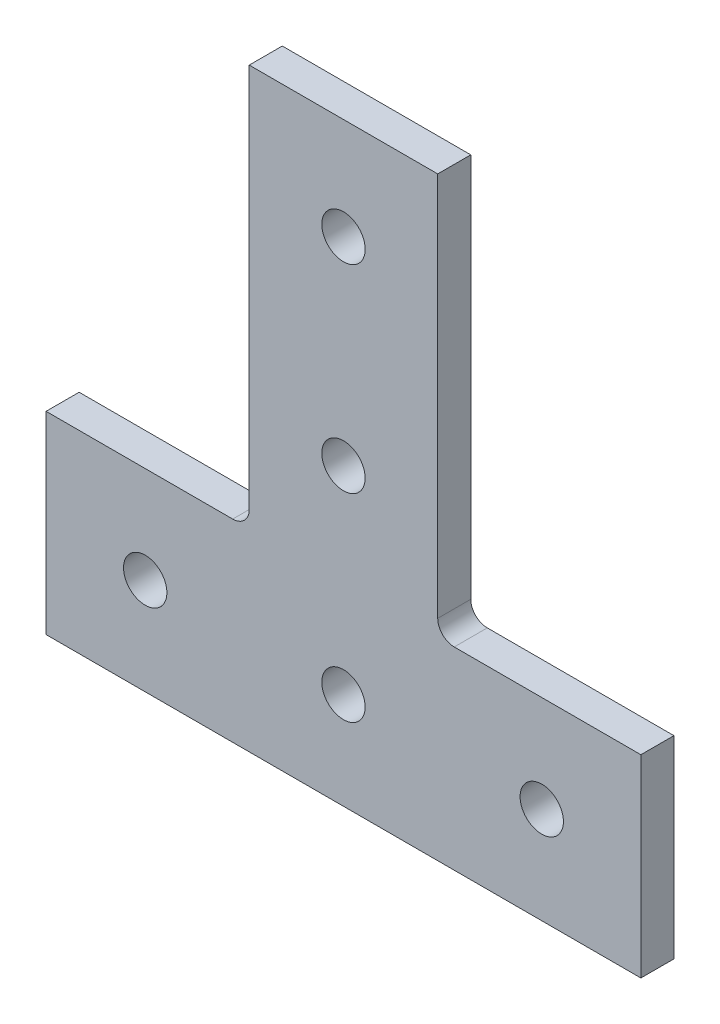
ISO-10303-21;
HEADER;
FILE_DESCRIPTION(('STEP AP214'),'2;1');
FILE_NAME('part.step','',(''),(''),'','','');
FILE_SCHEMA(('AUTOMOTIVE_DESIGN { 1 0 10303 214 1 1 1 1 }'));
ENDSEC;
DATA;
#1=APPLICATION_CONTEXT('core data for automotive mechanical design processes');
#2=APPLICATION_PROTOCOL_DEFINITION('international standard','automotive_design',2000,#1);
#3=PRODUCT_CONTEXT('',#1,'mechanical');
#4=PRODUCT('Part','Part','',(#3));
#5=PRODUCT_RELATED_PRODUCT_CATEGORY('part','',(#4));
#6=PRODUCT_DEFINITION_FORMATION('','',#4);
#7=PRODUCT_DEFINITION_CONTEXT('part definition',#1,'design');
#8=PRODUCT_DEFINITION('design','',#6,#7);
#9=PRODUCT_DEFINITION_SHAPE('','',#8);
#10=(LENGTH_UNIT() NAMED_UNIT(*) SI_UNIT(.MILLI.,.METRE.));
#11=(NAMED_UNIT(*) PLANE_ANGLE_UNIT() SI_UNIT($,.RADIAN.));
#12=(NAMED_UNIT(*) SI_UNIT($,.STERADIAN.) SOLID_ANGLE_UNIT());
#13=UNCERTAINTY_MEASURE_WITH_UNIT(LENGTH_MEASURE(1.E-05),#10,'distance_accuracy_value','');
#14=(GEOMETRIC_REPRESENTATION_CONTEXT(3) GLOBAL_UNCERTAINTY_ASSIGNED_CONTEXT((#13)) GLOBAL_UNIT_ASSIGNED_CONTEXT((#10,
#11,#12)) REPRESENTATION_CONTEXT('',''));
#15=CARTESIAN_POINT('',(0.,0.,0.));
#16=DIRECTION('',(0.,0.,1.));
#17=DIRECTION('',(1.,0.,0.));
#18=AXIS2_PLACEMENT_3D('',#15,#16,#17);
#19=CARTESIAN_POINT('',(-18.1102,-16.8148,-3.175));
#20=DIRECTION('',(-1.,0.,0.));
#21=DIRECTION('',(0.,-1.,0.));
#22=AXIS2_PLACEMENT_3D('',#19,#20,#21);
#23=PLANE('',#22);
#24=DIRECTION('',(0.,0.,1.));
#25=VECTOR('',#24,1.);
#26=CARTESIAN_POINT('',(-18.1102,-16.8148,-3.175));
#27=LINE('',#26,#25);
#28=CARTESIAN_POINT('',(-18.1102,-16.8148,-3.175));
#29=VERTEX_POINT('',#28);
#30=CARTESIAN_POINT('',(-18.1102,-16.8148,3.175));
#31=VERTEX_POINT('',#30);
#32=EDGE_CURVE('E44',#29,#31,#27,.T.);
#33=ORIENTED_EDGE('',*,*,#32,.T.);
#34=DIRECTION('',(0.,-1.,0.));
#35=VECTOR('',#34,1.);
#36=CARTESIAN_POINT('',(-18.1102,-16.8148,3.175));
#37=LINE('',#36,#35);
#38=CARTESIAN_POINT('',(-18.1102,57.15,3.175));
#39=VERTEX_POINT('',#38);
#40=EDGE_CURVE('E118',#39,#31,#37,.T.);
#41=ORIENTED_EDGE('',*,*,#40,.F.);
#42=DIRECTION('',(0.,0.,1.));
#43=VECTOR('',#42,1.);
#44=CARTESIAN_POINT('',(-18.1102,57.15,-3.175));
#45=LINE('',#44,#43);
#46=CARTESIAN_POINT('',(-18.1102,57.15,-3.175));
#47=VERTEX_POINT('',#46);
#48=EDGE_CURVE('E11',#47,#39,#45,.T.);
#49=ORIENTED_EDGE('',*,*,#48,.F.);
#50=DIRECTION('',(0.,-1.,0.));
#51=VECTOR('',#50,1.);
#52=CARTESIAN_POINT('',(-18.1102,-16.8148,-3.175));
#53=LINE('',#52,#51);
#54=EDGE_CURVE('E119',#47,#29,#53,.T.);
#55=ORIENTED_EDGE('',*,*,#54,.T.);
#56=EDGE_LOOP('',(#33,#41,#49,#55));
#57=FACE_BOUND('',#56,.T.);
#58=ADVANCED_FACE('F41',(#57),#23,.T.);
#59=CARTESIAN_POINT('',(18.1102,57.15,-3.175));
#60=DIRECTION('',(0.,1.,0.));
#61=DIRECTION('',(-1.,0.,0.));
#62=AXIS2_PLACEMENT_3D('',#59,#60,#61);
#63=PLANE('',#62);
#64=ORIENTED_EDGE('',*,*,#48,.T.);
#65=DIRECTION('',(-1.,0.,0.));
#66=VECTOR('',#65,1.);
#67=CARTESIAN_POINT('',(18.1102,57.15,3.175));
#68=LINE('',#67,#66);
#69=CARTESIAN_POINT('',(18.1102,57.15,3.175));
#70=VERTEX_POINT('',#69);
#71=EDGE_CURVE('E138',#70,#39,#68,.T.);
#72=ORIENTED_EDGE('',*,*,#71,.F.);
#73=DIRECTION('',(0.,0.,1.));
#74=VECTOR('',#73,1.);
#75=CARTESIAN_POINT('',(18.1102,57.15,-3.175));
#76=LINE('',#75,#74);
#77=CARTESIAN_POINT('',(18.1102,57.15,-3.175));
#78=VERTEX_POINT('',#77);
#79=EDGE_CURVE('E50',#78,#70,#76,.T.);
#80=ORIENTED_EDGE('',*,*,#79,.F.);
#81=DIRECTION('',(-1.,0.,0.));
#82=VECTOR('',#81,1.);
#83=CARTESIAN_POINT('',(18.1102,57.15,-3.175));
#84=LINE('',#83,#82);
#85=EDGE_CURVE('E125',#78,#47,#84,.T.);
#86=ORIENTED_EDGE('',*,*,#85,.T.);
#87=EDGE_LOOP('',(#64,#72,#80,#86));
#88=FACE_BOUND('',#87,.T.);
#89=ADVANCED_FACE('F291',(#88),#63,.T.);
#90=CARTESIAN_POINT('',(18.1102,-16.8148,-3.175));
#91=DIRECTION('',(1.,0.,0.));
#92=DIRECTION('',(0.,1.,0.));
#93=AXIS2_PLACEMENT_3D('',#90,#91,#92);
#94=PLANE('',#93);
#95=ORIENTED_EDGE('',*,*,#79,.T.);
#96=DIRECTION('',(0.,1.,0.));
#97=VECTOR('',#96,1.);
#98=CARTESIAN_POINT('',(18.1102,-16.8148,3.175));
#99=LINE('',#98,#97);
#100=CARTESIAN_POINT('',(18.1102,-16.8148,3.175));
#101=VERTEX_POINT('',#100);
#102=EDGE_CURVE('E173',#101,#70,#99,.T.);
#103=ORIENTED_EDGE('',*,*,#102,.F.);
#104=DIRECTION('',(0.,0.,1.));
#105=VECTOR('',#104,1.);
#106=CARTESIAN_POINT('',(18.1102,-16.8148,-3.175));
#107=LINE('',#106,#105);
#108=CARTESIAN_POINT('',(18.1102,-16.8148,-3.175));
#109=VERTEX_POINT('',#108);
#110=EDGE_CURVE('E214',#109,#101,#107,.T.);
#111=ORIENTED_EDGE('',*,*,#110,.F.);
#112=DIRECTION('',(0.,1.,0.));
#113=VECTOR('',#112,1.);
#114=CARTESIAN_POINT('',(18.1102,-16.8148,-3.175));
#115=LINE('',#114,#113);
#116=EDGE_CURVE('E207',#109,#78,#115,.T.);
#117=ORIENTED_EDGE('',*,*,#116,.T.);
#118=EDGE_LOOP('',(#95,#103,#111,#117));
#119=FACE_BOUND('',#118,.T.);
#120=ADVANCED_FACE('F289',(#119),#94,.T.);
#121=CARTESIAN_POINT('',(21.2852,-16.8148,-3.175));
#122=DIRECTION('',(0.,0.,1.));
#123=DIRECTION('',(1.,0.,0.));
#124=AXIS2_PLACEMENT_3D('',#121,#122,#123);
#125=CYLINDRICAL_SURFACE('',#124,3.175);
#126=ORIENTED_EDGE('',*,*,#110,.T.);
#127=CARTESIAN_POINT('',(21.2852,-16.8148,3.175));
#128=DIRECTION('',(0.,0.,-1.));
#129=DIRECTION('',(-1.,0.,0.));
#130=AXIS2_PLACEMENT_3D('',#127,#128,#129);
#131=CIRCLE('',#130,3.175);
#132=CARTESIAN_POINT('',(21.2852,-19.9898,3.175));
#133=VERTEX_POINT('',#132);
#134=EDGE_CURVE('E169',#133,#101,#131,.T.);
#135=ORIENTED_EDGE('',*,*,#134,.F.);
#136=DIRECTION('',(0.,0.,1.));
#137=VECTOR('',#136,1.);
#138=CARTESIAN_POINT('',(21.2852,-19.9898,-3.175));
#139=LINE('',#138,#137);
#140=CARTESIAN_POINT('',(21.2852,-19.9898,-3.175));
#141=VERTEX_POINT('',#140);
#142=EDGE_CURVE('E217',#141,#133,#139,.T.);
#143=ORIENTED_EDGE('',*,*,#142,.F.);
#144=CARTESIAN_POINT('',(21.2852,-16.8148,-3.175));
#145=DIRECTION('',(0.,0.,-1.));
#146=DIRECTION('',(-1.,0.,0.));
#147=AXIS2_PLACEMENT_3D('',#144,#145,#146);
#148=CIRCLE('',#147,3.175);
#149=EDGE_CURVE('E203',#141,#109,#148,.T.);
#150=ORIENTED_EDGE('',*,*,#149,.T.);
#151=EDGE_LOOP('',(#126,#135,#143,#150));
#152=FACE_BOUND('',#151,.T.);
#153=ADVANCED_FACE('F285',(#152),#125,.F.);
#154=CARTESIAN_POINT('',(57.15,-19.9898,-3.175));
#155=DIRECTION('',(0.,1.,0.));
#156=DIRECTION('',(-1.,0.,0.));
#157=AXIS2_PLACEMENT_3D('',#154,#155,#156);
#158=PLANE('',#157);
#159=ORIENTED_EDGE('',*,*,#142,.T.);
#160=DIRECTION('',(-1.,0.,0.));
#161=VECTOR('',#160,1.);
#162=CARTESIAN_POINT('',(57.15,-19.9898,3.175));
#163=LINE('',#162,#161);
#164=CARTESIAN_POINT('',(57.15,-19.9898,3.175));
#165=VERTEX_POINT('',#164);
#166=EDGE_CURVE('E165',#165,#133,#163,.T.);
#167=ORIENTED_EDGE('',*,*,#166,.F.);
#168=DIRECTION('',(0.,0.,1.));
#169=VECTOR('',#168,1.);
#170=CARTESIAN_POINT('',(57.15,-19.9898,-3.175));
#171=LINE('',#170,#169);
#172=CARTESIAN_POINT('',(57.15,-19.9898,-3.175));
#173=VERTEX_POINT('',#172);
#174=EDGE_CURVE('E220',#173,#165,#171,.T.);
#175=ORIENTED_EDGE('',*,*,#174,.F.);
#176=DIRECTION('',(-1.,0.,0.));
#177=VECTOR('',#176,1.);
#178=CARTESIAN_POINT('',(57.15,-19.9898,-3.175));
#179=LINE('',#178,#177);
#180=EDGE_CURVE('E199',#173,#141,#179,.T.);
#181=ORIENTED_EDGE('',*,*,#180,.T.);
#182=EDGE_LOOP('',(#159,#167,#175,#181));
#183=FACE_BOUND('',#182,.T.);
#184=ADVANCED_FACE('F283',(#183),#158,.T.);
#185=CARTESIAN_POINT('',(57.15,-57.15,-3.175));
#186=DIRECTION('',(1.,0.,0.));
#187=DIRECTION('',(0.,1.,0.));
#188=AXIS2_PLACEMENT_3D('',#185,#186,#187);
#189=PLANE('',#188);
#190=ORIENTED_EDGE('',*,*,#174,.T.);
#191=DIRECTION('',(0.,1.,0.));
#192=VECTOR('',#191,1.);
#193=CARTESIAN_POINT('',(57.15,-57.15,3.175));
#194=LINE('',#193,#192);
#195=CARTESIAN_POINT('',(57.15,-57.15,3.175));
#196=VERTEX_POINT('',#195);
#197=EDGE_CURVE('E161',#196,#165,#194,.T.);
#198=ORIENTED_EDGE('',*,*,#197,.F.);
#199=DIRECTION('',(0.,0.,1.));
#200=VECTOR('',#199,1.);
#201=CARTESIAN_POINT('',(57.15,-57.15,-3.175));
#202=LINE('',#201,#200);
#203=CARTESIAN_POINT('',(57.15,-57.15,-3.175));
#204=VERTEX_POINT('',#203);
#205=EDGE_CURVE('E223',#204,#196,#202,.T.);
#206=ORIENTED_EDGE('',*,*,#205,.F.);
#207=DIRECTION('',(0.,1.,0.));
#208=VECTOR('',#207,1.);
#209=CARTESIAN_POINT('',(57.15,-57.15,-3.175));
#210=LINE('',#209,#208);
#211=EDGE_CURVE('E195',#204,#173,#210,.T.);
#212=ORIENTED_EDGE('',*,*,#211,.T.);
#213=EDGE_LOOP('',(#190,#198,#206,#212));
#214=FACE_BOUND('',#213,.T.);
#215=ADVANCED_FACE('F278',(#214),#189,.T.);
#216=CARTESIAN_POINT('',(57.15,-57.15,-3.175));
#217=DIRECTION('',(0.,-1.,0.));
#218=DIRECTION('',(1.,0.,0.));
#219=AXIS2_PLACEMENT_3D('',#216,#217,#218);
#220=PLANE('',#219);
#221=ORIENTED_EDGE('',*,*,#205,.T.);
#222=DIRECTION('',(1.,0.,0.));
#223=VECTOR('',#222,1.);
#224=CARTESIAN_POINT('',(57.15,-57.15,3.175));
#225=LINE('',#224,#223);
#226=CARTESIAN_POINT('',(-57.15,-57.15,3.175));
#227=VERTEX_POINT('',#226);
#228=EDGE_CURVE('E157',#227,#196,#225,.T.);
#229=ORIENTED_EDGE('',*,*,#228,.F.);
#230=DIRECTION('',(0.,0.,1.));
#231=VECTOR('',#230,1.);
#232=CARTESIAN_POINT('',(-57.15,-57.15,-3.175));
#233=LINE('',#232,#231);
#234=CARTESIAN_POINT('',(-57.15,-57.15,-3.175));
#235=VERTEX_POINT('',#234);
#236=EDGE_CURVE('E226',#235,#227,#233,.T.);
#237=ORIENTED_EDGE('',*,*,#236,.F.);
#238=DIRECTION('',(1.,0.,0.));
#239=VECTOR('',#238,1.);
#240=CARTESIAN_POINT('',(57.15,-57.15,-3.175));
#241=LINE('',#240,#239);
#242=EDGE_CURVE('E191',#235,#204,#241,.T.);
#243=ORIENTED_EDGE('',*,*,#242,.T.);
#244=EDGE_LOOP('',(#221,#229,#237,#243));
#245=FACE_BOUND('',#244,.T.);
#246=ADVANCED_FACE('F271',(#245),#220,.T.);
#247=CARTESIAN_POINT('',(-57.15,-57.15,-3.175));
#248=DIRECTION('',(-1.,0.,0.));
#249=DIRECTION('',(0.,-1.,0.));
#250=AXIS2_PLACEMENT_3D('',#247,#248,#249);
#251=PLANE('',#250);
#252=ORIENTED_EDGE('',*,*,#236,.T.);
#253=DIRECTION('',(0.,-1.,0.));
#254=VECTOR('',#253,1.);
#255=CARTESIAN_POINT('',(-57.15,-57.15,3.175));
#256=LINE('',#255,#254);
#257=CARTESIAN_POINT('',(-57.15,-19.9898,3.175));
#258=VERTEX_POINT('',#257);
#259=EDGE_CURVE('E153',#258,#227,#256,.T.);
#260=ORIENTED_EDGE('',*,*,#259,.F.);
#261=DIRECTION('',(0.,0.,1.));
#262=VECTOR('',#261,1.);
#263=CARTESIAN_POINT('',(-57.15,-19.9898,-3.175));
#264=LINE('',#263,#262);
#265=CARTESIAN_POINT('',(-57.15,-19.9898,-3.175));
#266=VERTEX_POINT('',#265);
#267=EDGE_CURVE('E229',#266,#258,#264,.T.);
#268=ORIENTED_EDGE('',*,*,#267,.F.);
#269=DIRECTION('',(0.,-1.,0.));
#270=VECTOR('',#269,1.);
#271=CARTESIAN_POINT('',(-57.15,-57.15,-3.175));
#272=LINE('',#271,#270);
#273=EDGE_CURVE('E187',#266,#235,#272,.T.);
#274=ORIENTED_EDGE('',*,*,#273,.T.);
#275=EDGE_LOOP('',(#252,#260,#268,#274));
#276=FACE_BOUND('',#275,.T.);
#277=ADVANCED_FACE('F268',(#276),#251,.T.);
#278=CARTESIAN_POINT('',(-57.15,-19.9898,-3.175));
#279=DIRECTION('',(0.,1.,0.));
#280=DIRECTION('',(-1.,0.,0.));
#281=AXIS2_PLACEMENT_3D('',#278,#279,#280);
#282=PLANE('',#281);
#283=ORIENTED_EDGE('',*,*,#267,.T.);
#284=DIRECTION('',(-1.,0.,0.));
#285=VECTOR('',#284,1.);
#286=CARTESIAN_POINT('',(-57.15,-19.9898,3.175));
#287=LINE('',#286,#285);
#288=CARTESIAN_POINT('',(-21.2852,-19.9898,3.175));
#289=VERTEX_POINT('',#288);
#290=EDGE_CURVE('E133',#289,#258,#287,.T.);
#291=ORIENTED_EDGE('',*,*,#290,.F.);
#292=DIRECTION('',(0.,0.,1.));
#293=VECTOR('',#292,1.);
#294=CARTESIAN_POINT('',(-21.2852,-19.9898,-3.175));
#295=LINE('',#294,#293);
#296=CARTESIAN_POINT('',(-21.2852,-19.9898,-3.175));
#297=VERTEX_POINT('',#296);
#298=EDGE_CURVE('E124',#297,#289,#295,.T.);
#299=ORIENTED_EDGE('',*,*,#298,.F.);
#300=DIRECTION('',(-1.,0.,0.));
#301=VECTOR('',#300,1.);
#302=CARTESIAN_POINT('',(-57.15,-19.9898,-3.175));
#303=LINE('',#302,#301);
#304=EDGE_CURVE('E183',#297,#266,#303,.T.);
#305=ORIENTED_EDGE('',*,*,#304,.T.);
#306=EDGE_LOOP('',(#283,#291,#299,#305));
#307=FACE_BOUND('',#306,.T.);
#308=ADVANCED_FACE('F262',(#307),#282,.T.);
#309=CARTESIAN_POINT('',(-21.2852,-16.8148,-3.175));
#310=DIRECTION('',(0.,0.,1.));
#311=DIRECTION('',(1.,0.,0.));
#312=AXIS2_PLACEMENT_3D('',#309,#310,#311);
#313=CYLINDRICAL_SURFACE('',#312,3.175);
#314=ORIENTED_EDGE('',*,*,#298,.T.);
#315=CARTESIAN_POINT('',(-21.2852,-16.8148,3.175));
#316=DIRECTION('',(0.,0.,-1.));
#317=DIRECTION('',(-1.,0.,0.));
#318=AXIS2_PLACEMENT_3D('',#315,#316,#317);
#319=CIRCLE('',#318,3.175);
#320=EDGE_CURVE('E127',#31,#289,#319,.T.);
#321=ORIENTED_EDGE('',*,*,#320,.F.);
#322=ORIENTED_EDGE('',*,*,#32,.F.);
#323=CARTESIAN_POINT('',(-21.2852,-16.8148,-3.175));
#324=DIRECTION('',(0.,0.,-1.));
#325=DIRECTION('',(-1.,0.,0.));
#326=AXIS2_PLACEMENT_3D('',#323,#324,#325);
#327=CIRCLE('',#326,3.175);
#328=EDGE_CURVE('E180',#29,#297,#327,.T.);
#329=ORIENTED_EDGE('',*,*,#328,.T.);
#330=EDGE_LOOP('',(#314,#321,#322,#329));
#331=FACE_BOUND('',#330,.T.);
#332=ADVANCED_FACE('F128',(#331),#313,.F.);
#333=CARTESIAN_POINT('',(21.2852,-16.8148,-3.175));
#334=DIRECTION('',(0.,0.,-1.));
#335=DIRECTION('',(-1.,0.,0.));
#336=AXIS2_PLACEMENT_3D('',#333,#334,#335);
#337=PLANE('',#336);
#338=CARTESIAN_POINT('',(38.1,-38.5699,-3.175));
#339=DIRECTION('',(0.,0.,1.));
#340=DIRECTION('',(1.,0.,0.));
#341=AXIS2_PLACEMENT_3D('',#338,#339,#340);
#342=CIRCLE('',#341,4.1656);
#343=CARTESIAN_POINT('',(42.2656,-38.5699,-3.175));
#344=VERTEX_POINT('',#343);
#345=EDGE_CURVE('E140',#344,#344,#342,.T.);
#346=ORIENTED_EDGE('',*,*,#345,.T.);
#347=EDGE_LOOP('',(#346));
#348=FACE_BOUND('',#347,.T.);
#349=CARTESIAN_POINT('',(0.,-38.5699,-3.175));
#350=DIRECTION('',(0.,0.,1.));
#351=DIRECTION('',(1.,0.,0.));
#352=AXIS2_PLACEMENT_3D('',#349,#350,#351);
#353=CIRCLE('',#352,4.1656);
#354=CARTESIAN_POINT('',(4.16559999999997,-38.5699,-3.175));
#355=VERTEX_POINT('',#354);
#356=EDGE_CURVE('E328',#355,#355,#353,.T.);
#357=ORIENTED_EDGE('',*,*,#356,.T.);
#358=EDGE_LOOP('',(#357));
#359=FACE_BOUND('',#358,.T.);
#360=CARTESIAN_POINT('',(-38.1,-38.5699,-3.175));
#361=DIRECTION('',(0.,0.,1.));
#362=DIRECTION('',(1.,0.,0.));
#363=AXIS2_PLACEMENT_3D('',#360,#361,#362);
#364=CIRCLE('',#363,4.1656);
#365=CARTESIAN_POINT('',(-33.9344,-38.5699,-3.175));
#366=VERTEX_POINT('',#365);
#367=EDGE_CURVE('E332',#366,#366,#364,.T.);
#368=ORIENTED_EDGE('',*,*,#367,.T.);
#369=EDGE_LOOP('',(#368));
#370=FACE_BOUND('',#369,.T.);
#371=CARTESIAN_POINT('',(0.,-0.469899999999975,-3.175));
#372=DIRECTION('',(0.,0.,1.));
#373=DIRECTION('',(1.,0.,0.));
#374=AXIS2_PLACEMENT_3D('',#371,#372,#373);
#375=CIRCLE('',#374,4.1656);
#376=CARTESIAN_POINT('',(4.1656,-0.469899999999975,-3.175));
#377=VERTEX_POINT('',#376);
#378=EDGE_CURVE('E336',#377,#377,#375,.T.);
#379=ORIENTED_EDGE('',*,*,#378,.T.);
#380=EDGE_LOOP('',(#379));
#381=FACE_BOUND('',#380,.T.);
#382=CARTESIAN_POINT('',(0.,37.6301,-3.175));
#383=DIRECTION('',(0.,0.,1.));
#384=DIRECTION('',(-1.,0.,0.));
#385=AXIS2_PLACEMENT_3D('',#382,#383,#384);
#386=CIRCLE('',#385,4.1656);
#387=CARTESIAN_POINT('',(-4.16560000000003,37.6301,-3.175));
#388=VERTEX_POINT('',#387);
#389=EDGE_CURVE('E339',#388,#388,#386,.T.);
#390=ORIENTED_EDGE('',*,*,#389,.T.);
#391=EDGE_LOOP('',(#390));
#392=FACE_BOUND('',#391,.T.);
#393=ORIENTED_EDGE('',*,*,#54,.F.);
#394=ORIENTED_EDGE('',*,*,#85,.F.);
#395=ORIENTED_EDGE('',*,*,#116,.F.);
#396=ORIENTED_EDGE('',*,*,#149,.F.);
#397=ORIENTED_EDGE('',*,*,#180,.F.);
#398=ORIENTED_EDGE('',*,*,#211,.F.);
#399=ORIENTED_EDGE('',*,*,#242,.F.);
#400=ORIENTED_EDGE('',*,*,#273,.F.);
#401=ORIENTED_EDGE('',*,*,#304,.F.);
#402=ORIENTED_EDGE('',*,*,#328,.F.);
#403=EDGE_LOOP('',(#393,#394,#395,#396,#397,#398,#399,#400,#401,#402));
#404=FACE_BOUND('',#403,.T.);
#405=ADVANCED_FACE('F274',(#348,#359,#370,#381,#392,#404),#337,.T.);
#406=CARTESIAN_POINT('',(21.2852,-16.8148,3.175));
#407=DIRECTION('',(0.,0.,-1.));
#408=DIRECTION('',(-1.,0.,0.));
#409=AXIS2_PLACEMENT_3D('',#406,#407,#408);
#410=PLANE('',#409);
#411=CARTESIAN_POINT('',(38.1,-38.5699,3.175));
#412=DIRECTION('',(0.,0.,1.));
#413=DIRECTION('',(1.,0.,0.));
#414=AXIS2_PLACEMENT_3D('',#411,#412,#413);
#415=CIRCLE('',#414,4.1656);
#416=CARTESIAN_POINT('',(42.2656,-38.5699,3.175));
#417=VERTEX_POINT('',#416);
#418=EDGE_CURVE('E145',#417,#417,#415,.T.);
#419=ORIENTED_EDGE('',*,*,#418,.F.);
#420=EDGE_LOOP('',(#419));
#421=FACE_BOUND('',#420,.T.);
#422=CARTESIAN_POINT('',(0.,-38.5699,3.175));
#423=DIRECTION('',(0.,0.,1.));
#424=DIRECTION('',(1.,0.,0.));
#425=AXIS2_PLACEMENT_3D('',#422,#423,#424);
#426=CIRCLE('',#425,4.1656);
#427=CARTESIAN_POINT('',(4.16559999999997,-38.5699,3.175));
#428=VERTEX_POINT('',#427);
#429=EDGE_CURVE('E358',#428,#428,#426,.T.);
#430=ORIENTED_EDGE('',*,*,#429,.F.);
#431=EDGE_LOOP('',(#430));
#432=FACE_BOUND('',#431,.T.);
#433=CARTESIAN_POINT('',(-38.1,-38.5699,3.175));
#434=DIRECTION('',(0.,0.,1.));
#435=DIRECTION('',(1.,0.,0.));
#436=AXIS2_PLACEMENT_3D('',#433,#434,#435);
#437=CIRCLE('',#436,4.1656);
#438=CARTESIAN_POINT('',(-33.9344,-38.5699,3.175));
#439=VERTEX_POINT('',#438);
#440=EDGE_CURVE('E352',#439,#439,#437,.T.);
#441=ORIENTED_EDGE('',*,*,#440,.F.);
#442=EDGE_LOOP('',(#441));
#443=FACE_BOUND('',#442,.T.);
#444=CARTESIAN_POINT('',(0.,-0.469899999999975,3.175));
#445=DIRECTION('',(0.,0.,1.));
#446=DIRECTION('',(1.,0.,0.));
#447=AXIS2_PLACEMENT_3D('',#444,#445,#446);
#448=CIRCLE('',#447,4.1656);
#449=CARTESIAN_POINT('',(4.1656,-0.469899999999975,3.175));
#450=VERTEX_POINT('',#449);
#451=EDGE_CURVE('E342',#450,#450,#448,.T.);
#452=ORIENTED_EDGE('',*,*,#451,.F.);
#453=EDGE_LOOP('',(#452));
#454=FACE_BOUND('',#453,.T.);
#455=CARTESIAN_POINT('',(0.,37.6301,3.175));
#456=DIRECTION('',(0.,0.,1.));
#457=DIRECTION('',(-1.,0.,0.));
#458=AXIS2_PLACEMENT_3D('',#455,#456,#457);
#459=CIRCLE('',#458,4.1656);
#460=CARTESIAN_POINT('',(-4.16560000000003,37.6301,3.175));
#461=VERTEX_POINT('',#460);
#462=EDGE_CURVE('E148',#461,#461,#459,.T.);
#463=ORIENTED_EDGE('',*,*,#462,.F.);
#464=EDGE_LOOP('',(#463));
#465=FACE_BOUND('',#464,.T.);
#466=ORIENTED_EDGE('',*,*,#40,.T.);
#467=ORIENTED_EDGE('',*,*,#320,.T.);
#468=ORIENTED_EDGE('',*,*,#290,.T.);
#469=ORIENTED_EDGE('',*,*,#259,.T.);
#470=ORIENTED_EDGE('',*,*,#228,.T.);
#471=ORIENTED_EDGE('',*,*,#197,.T.);
#472=ORIENTED_EDGE('',*,*,#166,.T.);
#473=ORIENTED_EDGE('',*,*,#134,.T.);
#474=ORIENTED_EDGE('',*,*,#102,.T.);
#475=ORIENTED_EDGE('',*,*,#71,.T.);
#476=EDGE_LOOP('',(#466,#467,#468,#469,#470,#471,#472,#473,#474,#475));
#477=FACE_BOUND('',#476,.T.);
#478=ADVANCED_FACE('F136',(#421,#432,#443,#454,#465,#477),#410,.F.);
#479=CARTESIAN_POINT('',(0.,37.6301,-3.175));
#480=DIRECTION('',(0.,0.,1.));
#481=DIRECTION('',(1.,0.,0.));
#482=AXIS2_PLACEMENT_3D('',#479,#480,#481);
#483=CYLINDRICAL_SURFACE('',#482,4.1656);
#484=ORIENTED_EDGE('',*,*,#389,.F.);
#485=EDGE_LOOP('',(#484));
#486=FACE_BOUND('',#485,.T.);
#487=ORIENTED_EDGE('',*,*,#462,.T.);
#488=EDGE_LOOP('',(#487));
#489=FACE_BOUND('',#488,.T.);
#490=ADVANCED_FACE('F321',(#486,#489),#483,.F.);
#491=CARTESIAN_POINT('',(0.,-0.469899999999975,-3.175));
#492=DIRECTION('',(0.,0.,1.));
#493=DIRECTION('',(1.,0.,0.));
#494=AXIS2_PLACEMENT_3D('',#491,#492,#493);
#495=CYLINDRICAL_SURFACE('',#494,4.1656);
#496=ORIENTED_EDGE('',*,*,#378,.F.);
#497=EDGE_LOOP('',(#496));
#498=FACE_BOUND('',#497,.T.);
#499=ORIENTED_EDGE('',*,*,#451,.T.);
#500=EDGE_LOOP('',(#499));
#501=FACE_BOUND('',#500,.T.);
#502=ADVANCED_FACE('F380',(#498,#501),#495,.F.);
#503=CARTESIAN_POINT('',(-38.1,-38.5699,-3.175));
#504=DIRECTION('',(0.,0.,1.));
#505=DIRECTION('',(1.,0.,0.));
#506=AXIS2_PLACEMENT_3D('',#503,#504,#505);
#507=CYLINDRICAL_SURFACE('',#506,4.1656);
#508=ORIENTED_EDGE('',*,*,#367,.F.);
#509=EDGE_LOOP('',(#508));
#510=FACE_BOUND('',#509,.T.);
#511=ORIENTED_EDGE('',*,*,#440,.T.);
#512=EDGE_LOOP('',(#511));
#513=FACE_BOUND('',#512,.T.);
#514=ADVANCED_FACE('F385',(#510,#513),#507,.F.);
#515=CARTESIAN_POINT('',(0.,-38.5699,-3.175));
#516=DIRECTION('',(0.,0.,1.));
#517=DIRECTION('',(1.,0.,0.));
#518=AXIS2_PLACEMENT_3D('',#515,#516,#517);
#519=CYLINDRICAL_SURFACE('',#518,4.1656);
#520=ORIENTED_EDGE('',*,*,#356,.F.);
#521=EDGE_LOOP('',(#520));
#522=FACE_BOUND('',#521,.T.);
#523=ORIENTED_EDGE('',*,*,#429,.T.);
#524=EDGE_LOOP('',(#523));
#525=FACE_BOUND('',#524,.T.);
#526=ADVANCED_FACE('F391',(#522,#525),#519,.F.);
#527=CARTESIAN_POINT('',(38.1,-38.5699,-3.175));
#528=DIRECTION('',(0.,0.,1.));
#529=DIRECTION('',(1.,0.,0.));
#530=AXIS2_PLACEMENT_3D('',#527,#528,#529);
#531=CYLINDRICAL_SURFACE('',#530,4.1656);
#532=ORIENTED_EDGE('',*,*,#345,.F.);
#533=EDGE_LOOP('',(#532));
#534=FACE_BOUND('',#533,.T.);
#535=ORIENTED_EDGE('',*,*,#418,.T.);
#536=EDGE_LOOP('',(#535));
#537=FACE_BOUND('',#536,.T.);
#538=ADVANCED_FACE('F369',(#534,#537),#531,.F.);
#539=CLOSED_SHELL('',(#58,#89,#120,#153,#184,#215,#246,#277,#308,#332,#405,#478,#490,#502,#514,
#526,#538));
#540=MANIFOLD_SOLID_BREP('B2',#539);
#541=ADVANCED_BREP_SHAPE_REPRESENTATION('',(#18,#540),#14);
#542=SHAPE_DEFINITION_REPRESENTATION(#9,#541);
ENDSEC;
END-ISO-10303-21;
